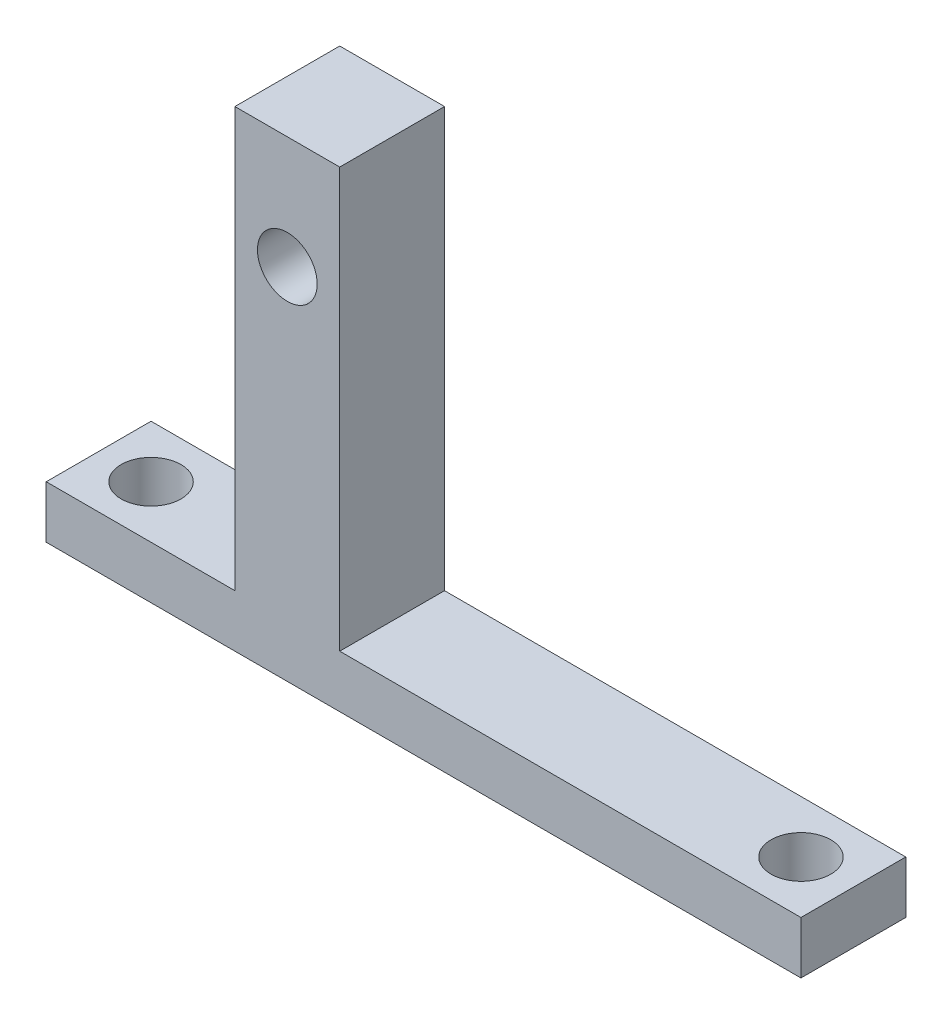
ISO-10303-21;
HEADER;
FILE_DESCRIPTION(('STEP AP214'),'2;1');
FILE_NAME('part.step','',(''),(''),'','','');
FILE_SCHEMA(('AUTOMOTIVE_DESIGN { 1 0 10303 214 1 1 1 1 }'));
ENDSEC;
DATA;
#1=APPLICATION_CONTEXT('core data for automotive mechanical design processes');
#2=APPLICATION_PROTOCOL_DEFINITION('international standard','automotive_design',2000,#1);
#3=PRODUCT_CONTEXT('',#1,'mechanical');
#4=PRODUCT('Part','Part','',(#3));
#5=PRODUCT_RELATED_PRODUCT_CATEGORY('part','',(#4));
#6=PRODUCT_DEFINITION_FORMATION('','',#4);
#7=PRODUCT_DEFINITION_CONTEXT('part definition',#1,'design');
#8=PRODUCT_DEFINITION('design','',#6,#7);
#9=PRODUCT_DEFINITION_SHAPE('','',#8);
#10=(LENGTH_UNIT() NAMED_UNIT(*) SI_UNIT(.MILLI.,.METRE.));
#11=(NAMED_UNIT(*) PLANE_ANGLE_UNIT() SI_UNIT($,.RADIAN.));
#12=(NAMED_UNIT(*) SI_UNIT($,.STERADIAN.) SOLID_ANGLE_UNIT());
#13=UNCERTAINTY_MEASURE_WITH_UNIT(LENGTH_MEASURE(1.E-05),#10,'distance_accuracy_value','');
#14=(GEOMETRIC_REPRESENTATION_CONTEXT(3) GLOBAL_UNCERTAINTY_ASSIGNED_CONTEXT((#13)) GLOBAL_UNIT_ASSIGNED_CONTEXT((#10,
#11,#12)) REPRESENTATION_CONTEXT('',''));
#15=CARTESIAN_POINT('',(0.,0.,0.));
#16=DIRECTION('',(0.,0.,1.));
#17=DIRECTION('',(1.,0.,0.));
#18=AXIS2_PLACEMENT_3D('',#15,#16,#17);
#19=CARTESIAN_POINT('',(0.,3.81,0.));
#20=DIRECTION('',(0.,1.,0.));
#21=DIRECTION('',(0.,0.,1.));
#22=AXIS2_PLACEMENT_3D('',#19,#20,#21);
#23=PLANE('',#22);
#24=DIRECTION('',(0.,0.,1.));
#25=VECTOR('',#24,1.);
#26=CARTESIAN_POINT('',(-10.9096097560975,3.81,25.0499756097561));
#27=LINE('',#26,#25);
#28=CARTESIAN_POINT('',(-10.9096097560975,3.81,25.0499756097561));
#29=VERTEX_POINT('',#28);
#30=CARTESIAN_POINT('',(-10.9096097560975,3.81,32.6699756097561));
#31=VERTEX_POINT('',#30);
#32=EDGE_CURVE('E50',#29,#31,#27,.T.);
#33=ORIENTED_EDGE('',*,*,#32,.F.);
#34=DIRECTION('',(-1.,0.,0.));
#35=VECTOR('',#34,1.);
#36=CARTESIAN_POINT('',(-24.6256097560975,3.81,25.0499756097561));
#37=LINE('',#36,#35);
#38=CARTESIAN_POINT('',(-24.6256097560975,3.81,25.0499756097561));
#39=VERTEX_POINT('',#38);
#40=EDGE_CURVE('E148',#29,#39,#37,.T.);
#41=ORIENTED_EDGE('',*,*,#40,.T.);
#42=DIRECTION('',(0.,0.,1.));
#43=VECTOR('',#42,1.);
#44=CARTESIAN_POINT('',(-24.6256097560975,3.81,25.0499756097561));
#45=LINE('',#44,#43);
#46=CARTESIAN_POINT('',(-24.6256097560975,3.81,32.6699756097561));
#47=VERTEX_POINT('',#46);
#48=EDGE_CURVE('E139',#39,#47,#45,.T.);
#49=ORIENTED_EDGE('',*,*,#48,.T.);
#50=DIRECTION('',(1.,0.,0.));
#51=VECTOR('',#50,1.);
#52=CARTESIAN_POINT('',(-24.6256097560975,3.81,32.6699756097561));
#53=LINE('',#52,#51);
#54=EDGE_CURVE('E144',#47,#31,#53,.T.);
#55=ORIENTED_EDGE('',*,*,#54,.T.);
#56=EDGE_LOOP('',(#33,#41,#49,#55));
#57=FACE_BOUND('',#56,.T.);
#58=CARTESIAN_POINT('',(-20.8156097560975,3.81,28.8599756097561));
#59=DIRECTION('',(0.,1.,0.));
#60=DIRECTION('',(0.,0.,1.));
#61=AXIS2_PLACEMENT_3D('',#58,#59,#60);
#62=CIRCLE('',#61,2.1717);
#63=CARTESIAN_POINT('',(-20.8156097560975,3.81,31.0316756097561));
#64=VERTEX_POINT('',#63);
#65=EDGE_CURVE('E134',#64,#64,#62,.T.);
#66=ORIENTED_EDGE('',*,*,#65,.F.);
#67=EDGE_LOOP('',(#66));
#68=FACE_BOUND('',#67,.T.);
#69=ADVANCED_FACE('F35',(#57,#68),#23,.T.);
#70=CARTESIAN_POINT('',(-24.6256097560975,3.81,25.0499756097561));
#71=DIRECTION('',(1.,0.,0.));
#72=DIRECTION('',(0.,0.,-1.));
#73=AXIS2_PLACEMENT_3D('',#70,#71,#72);
#74=PLANE('',#73);
#75=DIRECTION('',(0.,0.,1.));
#76=VECTOR('',#75,1.);
#77=CARTESIAN_POINT('',(-24.6256097560975,0.,25.0499756097561));
#78=LINE('',#77,#76);
#79=CARTESIAN_POINT('',(-24.6256097560975,0.,25.0499756097561));
#80=VERTEX_POINT('',#79);
#81=CARTESIAN_POINT('',(-24.6256097560975,0.,32.6699756097561));
#82=VERTEX_POINT('',#81);
#83=EDGE_CURVE('E133',#80,#82,#78,.T.);
#84=ORIENTED_EDGE('',*,*,#83,.T.);
#85=DIRECTION('',(0.,-1.,0.));
#86=VECTOR('',#85,1.);
#87=CARTESIAN_POINT('',(-24.6256097560975,3.81,32.6699756097561));
#88=LINE('',#87,#86);
#89=EDGE_CURVE('E11',#47,#82,#88,.T.);
#90=ORIENTED_EDGE('',*,*,#89,.F.);
#91=ORIENTED_EDGE('',*,*,#48,.F.);
#92=DIRECTION('',(0.,-1.,0.));
#93=VECTOR('',#92,1.);
#94=CARTESIAN_POINT('',(-24.6256097560975,3.81,25.0499756097561));
#95=LINE('',#94,#93);
#96=EDGE_CURVE('E151',#39,#80,#95,.T.);
#97=ORIENTED_EDGE('',*,*,#96,.T.);
#98=EDGE_LOOP('',(#84,#90,#91,#97));
#99=FACE_BOUND('',#98,.T.);
#100=ADVANCED_FACE('F37',(#99),#74,.F.);
#101=CARTESIAN_POINT('',(-24.6256097560975,3.81,32.6699756097561));
#102=DIRECTION('',(0.,0.,-1.));
#103=DIRECTION('',(-1.,0.,0.));
#104=AXIS2_PLACEMENT_3D('',#101,#102,#103);
#105=PLANE('',#104);
#106=CARTESIAN_POINT('',(-7.09960975609753,26.0985,32.6699756097561));
#107=DIRECTION('',(0.,0.,1.));
#108=DIRECTION('',(1.,0.,0.));
#109=AXIS2_PLACEMENT_3D('',#106,#107,#108);
#110=CIRCLE('',#109,2.1717);
#111=CARTESIAN_POINT('',(-4.92790975609753,26.0985,32.6699756097561));
#112=VERTEX_POINT('',#111);
#113=EDGE_CURVE('E191',#112,#112,#110,.T.);
#114=ORIENTED_EDGE('',*,*,#113,.F.);
#115=EDGE_LOOP('',(#114));
#116=FACE_BOUND('',#115,.T.);
#117=DIRECTION('',(1.,0.,0.));
#118=VECTOR('',#117,1.);
#119=CARTESIAN_POINT('',(-24.6256097560975,0.,32.6699756097561));
#120=LINE('',#119,#118);
#121=CARTESIAN_POINT('',(30.2383902439025,0.,32.6699756097561));
#122=VERTEX_POINT('',#121);
#123=EDGE_CURVE('E154',#82,#122,#120,.T.);
#124=ORIENTED_EDGE('',*,*,#123,.T.);
#125=DIRECTION('',(0.,-1.,0.));
#126=VECTOR('',#125,1.);
#127=CARTESIAN_POINT('',(30.2383902439025,3.81,32.6699756097561));
#128=LINE('',#127,#126);
#129=CARTESIAN_POINT('',(30.2383902439025,3.81,32.6699756097561));
#130=VERTEX_POINT('',#129);
#131=EDGE_CURVE('E43',#130,#122,#128,.T.);
#132=ORIENTED_EDGE('',*,*,#131,.F.);
#133=CARTESIAN_POINT('',(-3.28960975609753,3.81,32.6699756097561));
#134=VERTEX_POINT('',#133);
#135=EDGE_CURVE('E142',#134,#130,#53,.T.);
#136=ORIENTED_EDGE('',*,*,#135,.F.);
#137=DIRECTION('',(0.,-1.,0.));
#138=VECTOR('',#137,1.);
#139=CARTESIAN_POINT('',(-3.28960975609753,34.29,32.6699756097561));
#140=LINE('',#139,#138);
#141=CARTESIAN_POINT('',(-3.28960975609753,34.29,32.6699756097561));
#142=VERTEX_POINT('',#141);
#143=EDGE_CURVE('E106',#142,#134,#140,.T.);
#144=ORIENTED_EDGE('',*,*,#143,.F.);
#145=DIRECTION('',(1.,0.,0.));
#146=VECTOR('',#145,1.);
#147=CARTESIAN_POINT('',(-10.9096097560975,34.29,32.6699756097561));
#148=LINE('',#147,#146);
#149=CARTESIAN_POINT('',(-10.9096097560975,34.29,32.6699756097561));
#150=VERTEX_POINT('',#149);
#151=EDGE_CURVE('E100',#150,#142,#148,.T.);
#152=ORIENTED_EDGE('',*,*,#151,.F.);
#153=DIRECTION('',(0.,-1.,0.));
#154=VECTOR('',#153,1.);
#155=CARTESIAN_POINT('',(-10.9096097560975,34.29,32.6699756097561));
#156=LINE('',#155,#154);
#157=EDGE_CURVE('E104',#150,#31,#156,.T.);
#158=ORIENTED_EDGE('',*,*,#157,.T.);
#159=ORIENTED_EDGE('',*,*,#54,.F.);
#160=ORIENTED_EDGE('',*,*,#89,.T.);
#161=EDGE_LOOP('',(#124,#132,#136,#144,#152,#158,#159,#160));
#162=FACE_BOUND('',#161,.T.);
#163=ADVANCED_FACE('F102',(#116,#162),#105,.F.);
#164=CARTESIAN_POINT('',(30.2383902439025,3.81,25.0499756097561));
#165=DIRECTION('',(-1.,0.,0.));
#166=DIRECTION('',(0.,0.,1.));
#167=AXIS2_PLACEMENT_3D('',#164,#165,#166);
#168=PLANE('',#167);
#169=DIRECTION('',(0.,0.,-1.));
#170=VECTOR('',#169,1.);
#171=CARTESIAN_POINT('',(30.2383902439025,0.,25.0499756097561));
#172=LINE('',#171,#170);
#173=CARTESIAN_POINT('',(30.2383902439025,0.,25.0499756097561));
#174=VERTEX_POINT('',#173);
#175=EDGE_CURVE('E156',#122,#174,#172,.T.);
#176=ORIENTED_EDGE('',*,*,#175,.T.);
#177=DIRECTION('',(0.,-1.,0.));
#178=VECTOR('',#177,1.);
#179=CARTESIAN_POINT('',(30.2383902439025,3.81,25.0499756097561));
#180=LINE('',#179,#178);
#181=CARTESIAN_POINT('',(30.2383902439025,3.81,25.0499756097561));
#182=VERTEX_POINT('',#181);
#183=EDGE_CURVE('E161',#182,#174,#180,.T.);
#184=ORIENTED_EDGE('',*,*,#183,.F.);
#185=DIRECTION('',(0.,0.,-1.));
#186=VECTOR('',#185,1.);
#187=CARTESIAN_POINT('',(30.2383902439025,3.81,25.0499756097561));
#188=LINE('',#187,#186);
#189=EDGE_CURVE('E146',#130,#182,#188,.T.);
#190=ORIENTED_EDGE('',*,*,#189,.F.);
#191=ORIENTED_EDGE('',*,*,#131,.T.);
#192=EDGE_LOOP('',(#176,#184,#190,#191));
#193=FACE_BOUND('',#192,.T.);
#194=ADVANCED_FACE('F168',(#193),#168,.F.);
#195=CARTESIAN_POINT('',(-24.6256097560975,3.81,25.0499756097561));
#196=DIRECTION('',(0.,0.,1.));
#197=DIRECTION('',(1.,0.,0.));
#198=AXIS2_PLACEMENT_3D('',#195,#196,#197);
#199=PLANE('',#198);
#200=CARTESIAN_POINT('',(-7.09960975609753,26.0985,25.0499756097561));
#201=DIRECTION('',(0.,0.,1.));
#202=DIRECTION('',(1.,0.,0.));
#203=AXIS2_PLACEMENT_3D('',#200,#201,#202);
#204=CIRCLE('',#203,2.1717);
#205=CARTESIAN_POINT('',(-4.92790975609753,26.0985,25.0499756097561));
#206=VERTEX_POINT('',#205);
#207=EDGE_CURVE('E188',#206,#206,#204,.T.);
#208=ORIENTED_EDGE('',*,*,#207,.T.);
#209=EDGE_LOOP('',(#208));
#210=FACE_BOUND('',#209,.T.);
#211=DIRECTION('',(-1.,0.,0.));
#212=VECTOR('',#211,1.);
#213=CARTESIAN_POINT('',(-24.6256097560975,0.,25.0499756097561));
#214=LINE('',#213,#212);
#215=EDGE_CURVE('E143',#174,#80,#214,.T.);
#216=ORIENTED_EDGE('',*,*,#215,.T.);
#217=ORIENTED_EDGE('',*,*,#96,.F.);
#218=ORIENTED_EDGE('',*,*,#40,.F.);
#219=DIRECTION('',(0.,-1.,0.));
#220=VECTOR('',#219,1.);
#221=CARTESIAN_POINT('',(-10.9096097560975,34.29,25.0499756097561));
#222=LINE('',#221,#220);
#223=CARTESIAN_POINT('',(-10.9096097560975,34.29,25.0499756097561));
#224=VERTEX_POINT('',#223);
#225=EDGE_CURVE('E182',#224,#29,#222,.T.);
#226=ORIENTED_EDGE('',*,*,#225,.F.);
#227=DIRECTION('',(-1.,0.,0.));
#228=VECTOR('',#227,1.);
#229=CARTESIAN_POINT('',(-10.9096097560975,34.29,25.0499756097561));
#230=LINE('',#229,#228);
#231=CARTESIAN_POINT('',(-3.28960975609753,34.29,25.0499756097561));
#232=VERTEX_POINT('',#231);
#233=EDGE_CURVE('E115',#232,#224,#230,.T.);
#234=ORIENTED_EDGE('',*,*,#233,.F.);
#235=DIRECTION('',(0.,-1.,0.));
#236=VECTOR('',#235,1.);
#237=CARTESIAN_POINT('',(-3.28960975609753,34.29,25.0499756097561));
#238=LINE('',#237,#236);
#239=CARTESIAN_POINT('',(-3.28960975609753,3.81,25.0499756097561));
#240=VERTEX_POINT('',#239);
#241=EDGE_CURVE('E126',#232,#240,#238,.T.);
#242=ORIENTED_EDGE('',*,*,#241,.T.);
#243=EDGE_CURVE('E149',#182,#240,#37,.T.);
#244=ORIENTED_EDGE('',*,*,#243,.F.);
#245=ORIENTED_EDGE('',*,*,#183,.T.);
#246=EDGE_LOOP('',(#216,#217,#218,#226,#234,#242,#244,#245));
#247=FACE_BOUND('',#246,.T.);
#248=ADVANCED_FACE('F176',(#210,#247),#199,.F.);
#249=DIRECTION('',(0.,0.,-1.));
#250=VECTOR('',#249,1.);
#251=CARTESIAN_POINT('',(-3.28960975609753,3.81,25.0499756097561));
#252=LINE('',#251,#250);
#253=EDGE_CURVE('E58',#134,#240,#252,.T.);
#254=ORIENTED_EDGE('',*,*,#253,.F.);
#255=ORIENTED_EDGE('',*,*,#135,.T.);
#256=ORIENTED_EDGE('',*,*,#189,.T.);
#257=ORIENTED_EDGE('',*,*,#243,.T.);
#258=EDGE_LOOP('',(#254,#255,#256,#257));
#259=FACE_BOUND('',#258,.T.);
#260=CARTESIAN_POINT('',(26.4283902439025,3.81,28.8599756097561));
#261=DIRECTION('',(0.,1.,0.));
#262=DIRECTION('',(0.,0.,1.));
#263=AXIS2_PLACEMENT_3D('',#260,#261,#262);
#264=CIRCLE('',#263,2.1717);
#265=CARTESIAN_POINT('',(26.4283902439025,3.81,31.0316756097561));
#266=VERTEX_POINT('',#265);
#267=EDGE_CURVE('E121',#266,#266,#264,.T.);
#268=ORIENTED_EDGE('',*,*,#267,.F.);
#269=EDGE_LOOP('',(#268));
#270=FACE_BOUND('',#269,.T.);
#271=ADVANCED_FACE('F212',(#259,#270),#23,.T.);
#272=CARTESIAN_POINT('',(0.,0.,0.));
#273=DIRECTION('',(0.,1.,0.));
#274=DIRECTION('',(0.,0.,1.));
#275=AXIS2_PLACEMENT_3D('',#272,#273,#274);
#276=PLANE('',#275);
#277=CARTESIAN_POINT('',(-20.8156097560975,0.,28.8599756097561));
#278=DIRECTION('',(0.,1.,0.));
#279=DIRECTION('',(0.,0.,1.));
#280=AXIS2_PLACEMENT_3D('',#277,#278,#279);
#281=CIRCLE('',#280,2.1717);
#282=CARTESIAN_POINT('',(-20.8156097560975,0.,31.0316756097561));
#283=VERTEX_POINT('',#282);
#284=EDGE_CURVE('E130',#283,#283,#281,.T.);
#285=ORIENTED_EDGE('',*,*,#284,.T.);
#286=EDGE_LOOP('',(#285));
#287=FACE_BOUND('',#286,.T.);
#288=CARTESIAN_POINT('',(26.4283902439025,0.,28.8599756097561));
#289=DIRECTION('',(0.,1.,0.));
#290=DIRECTION('',(0.,0.,1.));
#291=AXIS2_PLACEMENT_3D('',#288,#289,#290);
#292=CIRCLE('',#291,2.1717);
#293=CARTESIAN_POINT('',(26.4283902439025,0.,31.0316756097561));
#294=VERTEX_POINT('',#293);
#295=EDGE_CURVE('E124',#294,#294,#292,.T.);
#296=ORIENTED_EDGE('',*,*,#295,.T.);
#297=EDGE_LOOP('',(#296));
#298=FACE_BOUND('',#297,.T.);
#299=ORIENTED_EDGE('',*,*,#83,.F.);
#300=ORIENTED_EDGE('',*,*,#215,.F.);
#301=ORIENTED_EDGE('',*,*,#175,.F.);
#302=ORIENTED_EDGE('',*,*,#123,.F.);
#303=EDGE_LOOP('',(#299,#300,#301,#302));
#304=FACE_BOUND('',#303,.T.);
#305=ADVANCED_FACE('F173',(#287,#298,#304),#276,.F.);
#306=CARTESIAN_POINT('',(26.4283902439025,0.,28.8599756097561));
#307=DIRECTION('',(0.,1.,0.));
#308=DIRECTION('',(0.,0.,1.));
#309=AXIS2_PLACEMENT_3D('',#306,#307,#308);
#310=CYLINDRICAL_SURFACE('',#309,2.1717);
#311=CARTESIAN_POINT('',(26.4283902439025,0.,31.0316756097561));
#312=CARTESIAN_POINT('',(26.4283902439025,0.0396874999999999,31.0316756097561));
#313=CARTESIAN_POINT('',(26.4283902439025,0.079375,31.0316756097561));
#314=CARTESIAN_POINT('',(26.4283902439025,0.15875,31.0316756097561));
#315=CARTESIAN_POINT('',(26.4283902439025,0.1984375,31.0316756097561));
#316=CARTESIAN_POINT('',(26.4283902439025,0.2778125,31.0316756097561));
#317=CARTESIAN_POINT('',(26.4283902439025,0.3175,31.0316756097561));
#318=CARTESIAN_POINT('',(26.4283902439025,0.396875,31.0316756097561));
#319=CARTESIAN_POINT('',(26.4283902439025,0.4365625,31.0316756097561));
#320=CARTESIAN_POINT('',(26.4283902439025,0.5159375,31.0316756097561));
#321=CARTESIAN_POINT('',(26.4283902439025,0.555625,31.0316756097561));
#322=CARTESIAN_POINT('',(26.4283902439025,0.635,31.0316756097561));
#323=CARTESIAN_POINT('',(26.4283902439025,0.6746875,31.0316756097561));
#324=CARTESIAN_POINT('',(26.4283902439025,0.7540625,31.0316756097561));
#325=CARTESIAN_POINT('',(26.4283902439025,0.79375,31.0316756097561));
#326=CARTESIAN_POINT('',(26.4283902439025,0.873125,31.0316756097561));
#327=CARTESIAN_POINT('',(26.4283902439025,0.9128125,31.0316756097561));
#328=CARTESIAN_POINT('',(26.4283902439025,0.9921875,31.0316756097561));
#329=CARTESIAN_POINT('',(26.4283902439025,1.031875,31.0316756097561));
#330=CARTESIAN_POINT('',(26.4283902439025,1.11125,31.0316756097561));
#331=CARTESIAN_POINT('',(26.4283902439025,1.1509375,31.0316756097561));
#332=CARTESIAN_POINT('',(26.4283902439025,1.2303125,31.0316756097561));
#333=CARTESIAN_POINT('',(26.4283902439025,1.27,31.0316756097561));
#334=CARTESIAN_POINT('',(26.4283902439025,1.349375,31.0316756097561));
#335=CARTESIAN_POINT('',(26.4283902439025,1.3890625,31.0316756097561));
#336=CARTESIAN_POINT('',(26.4283902439025,1.4684375,31.0316756097561));
#337=CARTESIAN_POINT('',(26.4283902439025,1.508125,31.0316756097561));
#338=CARTESIAN_POINT('',(26.4283902439025,1.5875,31.0316756097561));
#339=CARTESIAN_POINT('',(26.4283902439025,1.6271875,31.0316756097561));
#340=CARTESIAN_POINT('',(26.4283902439025,1.7065625,31.0316756097561));
#341=CARTESIAN_POINT('',(26.4283902439025,1.74625,31.0316756097561));
#342=CARTESIAN_POINT('',(26.4283902439025,1.825625,31.0316756097561));
#343=CARTESIAN_POINT('',(26.4283902439025,1.8653125,31.0316756097561));
#344=CARTESIAN_POINT('',(26.4283902439025,1.9446875,31.0316756097561));
#345=CARTESIAN_POINT('',(26.4283902439025,1.984375,31.0316756097561));
#346=CARTESIAN_POINT('',(26.4283902439025,2.06375,31.0316756097561));
#347=CARTESIAN_POINT('',(26.4283902439025,2.1034375,31.0316756097561));
#348=CARTESIAN_POINT('',(26.4283902439025,2.1828125,31.0316756097561));
#349=CARTESIAN_POINT('',(26.4283902439025,2.2225,31.0316756097561));
#350=CARTESIAN_POINT('',(26.4283902439025,2.301875,31.0316756097561));
#351=CARTESIAN_POINT('',(26.4283902439025,2.3415625,31.0316756097561));
#352=CARTESIAN_POINT('',(26.4283902439025,2.4209375,31.0316756097561));
#353=CARTESIAN_POINT('',(26.4283902439025,2.460625,31.0316756097561));
#354=CARTESIAN_POINT('',(26.4283902439025,2.54,31.0316756097561));
#355=CARTESIAN_POINT('',(26.4283902439025,2.5796875,31.0316756097561));
#356=CARTESIAN_POINT('',(26.4283902439025,2.6590625,31.0316756097561));
#357=CARTESIAN_POINT('',(26.4283902439025,2.69875,31.0316756097561));
#358=CARTESIAN_POINT('',(26.4283902439025,2.778125,31.0316756097561));
#359=CARTESIAN_POINT('',(26.4283902439025,2.8178125,31.0316756097561));
#360=CARTESIAN_POINT('',(26.4283902439025,2.8971875,31.0316756097561));
#361=CARTESIAN_POINT('',(26.4283902439025,2.936875,31.0316756097561));
#362=CARTESIAN_POINT('',(26.4283902439025,3.01625,31.0316756097561));
#363=CARTESIAN_POINT('',(26.4283902439025,3.0559375,31.0316756097561));
#364=CARTESIAN_POINT('',(26.4283902439025,3.1353125,31.0316756097561));
#365=CARTESIAN_POINT('',(26.4283902439025,3.175,31.0316756097561));
#366=CARTESIAN_POINT('',(26.4283902439025,3.254375,31.0316756097561));
#367=CARTESIAN_POINT('',(26.4283902439025,3.2940625,31.0316756097561));
#368=CARTESIAN_POINT('',(26.4283902439025,3.3734375,31.0316756097561));
#369=CARTESIAN_POINT('',(26.4283902439025,3.413125,31.0316756097561));
#370=CARTESIAN_POINT('',(26.4283902439025,3.4925,31.0316756097561));
#371=CARTESIAN_POINT('',(26.4283902439025,3.5321875,31.0316756097561));
#372=CARTESIAN_POINT('',(26.4283902439025,3.6115625,31.0316756097561));
#373=CARTESIAN_POINT('',(26.4283902439025,3.65125,31.0316756097561));
#374=CARTESIAN_POINT('',(26.4283902439025,3.730625,31.0316756097561));
#375=CARTESIAN_POINT('',(26.4283902439025,3.7703125,31.0316756097561));
#376=CARTESIAN_POINT('',(26.4283902439025,3.81,31.0316756097561));
#377=B_SPLINE_CURVE_WITH_KNOTS('',3,(#311,#312,#313,#314,#315,#316,#317,#318,#319,#320,#321,
#322,#323,#324,#325,#326,#327,#328,#329,#330,#331,#332,#333,#334,#335,#336,#337,#338,#339,#340,
#341,#342,#343,#344,#345,#346,#347,#348,#349,#350,#351,#352,#353,#354,#355,#356,#357,#358,#359,
#360,#361,#362,#363,#364,#365,#366,#367,#368,#369,#370,#371,#372,#373,#374,#375,#376),
.UNSPECIFIED.,.F.,.F.,(4,2,2,2,2,2,2,2,2,2,2,2,2,2,2,2,2,2,2,2,2,2,2,2,2,2,2,2,2,2,2,2,4),(0.,
0.1190625,0.238125,0.3571875,0.47625,0.5953125,0.714375,0.8334375,0.9525,1.0715625,1.190625,
1.3096875,1.42875,1.5478125,1.666875,1.7859375,1.905,2.0240625,2.143125,2.2621875,2.38125,
2.5003125,2.619375,2.7384375,2.8575,2.9765625,3.095625,3.2146875,3.33375,3.4528125,3.571875,
3.6909375,3.81),.UNSPECIFIED.);
#378=EDGE_CURVE('BSEAM222',#294,#266,#377,.T.);
#379=ORIENTED_EDGE('',*,*,#295,.F.);
#380=ORIENTED_EDGE('',*,*,#267,.T.);
#381=ORIENTED_EDGE('',*,*,#378,.T.);
#382=ORIENTED_EDGE('',*,*,#378,.F.);
#383=EDGE_LOOP('',(#379,#381,#380,#382));
#384=FACE_BOUND('',#383,.T.);
#385=ADVANCED_FACE('F222',(#384),#310,.F.);
#386=CARTESIAN_POINT('',(-20.8156097560975,0.,28.8599756097561));
#387=DIRECTION('',(0.,1.,0.));
#388=DIRECTION('',(0.,0.,1.));
#389=AXIS2_PLACEMENT_3D('',#386,#387,#388);
#390=CYLINDRICAL_SURFACE('',#389,2.1717);
#391=CARTESIAN_POINT('',(-20.8156097560975,0.,31.0316756097561));
#392=CARTESIAN_POINT('',(-20.8156097560975,0.0396874999999999,31.0316756097561));
#393=CARTESIAN_POINT('',(-20.8156097560975,0.079375,31.0316756097561));
#394=CARTESIAN_POINT('',(-20.8156097560975,0.15875,31.0316756097561));
#395=CARTESIAN_POINT('',(-20.8156097560975,0.1984375,31.0316756097561));
#396=CARTESIAN_POINT('',(-20.8156097560975,0.2778125,31.0316756097561));
#397=CARTESIAN_POINT('',(-20.8156097560975,0.3175,31.0316756097561));
#398=CARTESIAN_POINT('',(-20.8156097560975,0.396875,31.0316756097561));
#399=CARTESIAN_POINT('',(-20.8156097560975,0.4365625,31.0316756097561));
#400=CARTESIAN_POINT('',(-20.8156097560975,0.5159375,31.0316756097561));
#401=CARTESIAN_POINT('',(-20.8156097560975,0.555625,31.0316756097561));
#402=CARTESIAN_POINT('',(-20.8156097560975,0.635,31.0316756097561));
#403=CARTESIAN_POINT('',(-20.8156097560975,0.6746875,31.0316756097561));
#404=CARTESIAN_POINT('',(-20.8156097560975,0.7540625,31.0316756097561));
#405=CARTESIAN_POINT('',(-20.8156097560975,0.79375,31.0316756097561));
#406=CARTESIAN_POINT('',(-20.8156097560975,0.873125,31.0316756097561));
#407=CARTESIAN_POINT('',(-20.8156097560975,0.9128125,31.0316756097561));
#408=CARTESIAN_POINT('',(-20.8156097560975,0.9921875,31.0316756097561));
#409=CARTESIAN_POINT('',(-20.8156097560975,1.031875,31.0316756097561));
#410=CARTESIAN_POINT('',(-20.8156097560975,1.11125,31.0316756097561));
#411=CARTESIAN_POINT('',(-20.8156097560975,1.1509375,31.0316756097561));
#412=CARTESIAN_POINT('',(-20.8156097560975,1.2303125,31.0316756097561));
#413=CARTESIAN_POINT('',(-20.8156097560975,1.27,31.0316756097561));
#414=CARTESIAN_POINT('',(-20.8156097560975,1.349375,31.0316756097561));
#415=CARTESIAN_POINT('',(-20.8156097560975,1.3890625,31.0316756097561));
#416=CARTESIAN_POINT('',(-20.8156097560975,1.4684375,31.0316756097561));
#417=CARTESIAN_POINT('',(-20.8156097560975,1.508125,31.0316756097561));
#418=CARTESIAN_POINT('',(-20.8156097560975,1.5875,31.0316756097561));
#419=CARTESIAN_POINT('',(-20.8156097560975,1.6271875,31.0316756097561));
#420=CARTESIAN_POINT('',(-20.8156097560975,1.7065625,31.0316756097561));
#421=CARTESIAN_POINT('',(-20.8156097560975,1.74625,31.0316756097561));
#422=CARTESIAN_POINT('',(-20.8156097560975,1.825625,31.0316756097561));
#423=CARTESIAN_POINT('',(-20.8156097560975,1.8653125,31.0316756097561));
#424=CARTESIAN_POINT('',(-20.8156097560975,1.9446875,31.0316756097561));
#425=CARTESIAN_POINT('',(-20.8156097560975,1.984375,31.0316756097561));
#426=CARTESIAN_POINT('',(-20.8156097560975,2.06375,31.0316756097561));
#427=CARTESIAN_POINT('',(-20.8156097560975,2.1034375,31.0316756097561));
#428=CARTESIAN_POINT('',(-20.8156097560975,2.1828125,31.0316756097561));
#429=CARTESIAN_POINT('',(-20.8156097560975,2.2225,31.0316756097561));
#430=CARTESIAN_POINT('',(-20.8156097560975,2.301875,31.0316756097561));
#431=CARTESIAN_POINT('',(-20.8156097560975,2.3415625,31.0316756097561));
#432=CARTESIAN_POINT('',(-20.8156097560975,2.4209375,31.0316756097561));
#433=CARTESIAN_POINT('',(-20.8156097560975,2.460625,31.0316756097561));
#434=CARTESIAN_POINT('',(-20.8156097560975,2.54,31.0316756097561));
#435=CARTESIAN_POINT('',(-20.8156097560975,2.5796875,31.0316756097561));
#436=CARTESIAN_POINT('',(-20.8156097560975,2.6590625,31.0316756097561));
#437=CARTESIAN_POINT('',(-20.8156097560975,2.69875,31.0316756097561));
#438=CARTESIAN_POINT('',(-20.8156097560975,2.778125,31.0316756097561));
#439=CARTESIAN_POINT('',(-20.8156097560975,2.8178125,31.0316756097561));
#440=CARTESIAN_POINT('',(-20.8156097560975,2.8971875,31.0316756097561));
#441=CARTESIAN_POINT('',(-20.8156097560975,2.936875,31.0316756097561));
#442=CARTESIAN_POINT('',(-20.8156097560975,3.01625,31.0316756097561));
#443=CARTESIAN_POINT('',(-20.8156097560975,3.0559375,31.0316756097561));
#444=CARTESIAN_POINT('',(-20.8156097560975,3.1353125,31.0316756097561));
#445=CARTESIAN_POINT('',(-20.8156097560975,3.175,31.0316756097561));
#446=CARTESIAN_POINT('',(-20.8156097560975,3.254375,31.0316756097561));
#447=CARTESIAN_POINT('',(-20.8156097560975,3.2940625,31.0316756097561));
#448=CARTESIAN_POINT('',(-20.8156097560975,3.3734375,31.0316756097561));
#449=CARTESIAN_POINT('',(-20.8156097560975,3.413125,31.0316756097561));
#450=CARTESIAN_POINT('',(-20.8156097560975,3.4925,31.0316756097561));
#451=CARTESIAN_POINT('',(-20.8156097560975,3.5321875,31.0316756097561));
#452=CARTESIAN_POINT('',(-20.8156097560975,3.6115625,31.0316756097561));
#453=CARTESIAN_POINT('',(-20.8156097560975,3.65125,31.0316756097561));
#454=CARTESIAN_POINT('',(-20.8156097560975,3.730625,31.0316756097561));
#455=CARTESIAN_POINT('',(-20.8156097560975,3.7703125,31.0316756097561));
#456=CARTESIAN_POINT('',(-20.8156097560975,3.81,31.0316756097561));
#457=B_SPLINE_CURVE_WITH_KNOTS('',3,(#391,#392,#393,#394,#395,#396,#397,#398,#399,#400,#401,
#402,#403,#404,#405,#406,#407,#408,#409,#410,#411,#412,#413,#414,#415,#416,#417,#418,#419,#420,
#421,#422,#423,#424,#425,#426,#427,#428,#429,#430,#431,#432,#433,#434,#435,#436,#437,#438,#439,
#440,#441,#442,#443,#444,#445,#446,#447,#448,#449,#450,#451,#452,#453,#454,#455,#456),
.UNSPECIFIED.,.F.,.F.,(4,2,2,2,2,2,2,2,2,2,2,2,2,2,2,2,2,2,2,2,2,2,2,2,2,2,2,2,2,2,2,2,4),(0.,
0.1190625,0.238125,0.3571875,0.47625,0.5953125,0.714375,0.8334375,0.9525,1.0715625,1.190625,
1.3096875,1.42875,1.5478125,1.666875,1.7859375,1.905,2.0240625,2.143125,2.2621875,2.38125,
2.5003125,2.619375,2.7384375,2.8575,2.9765625,3.095625,3.2146875,3.33375,3.4528125,3.571875,
3.6909375,3.81),.UNSPECIFIED.);
#458=EDGE_CURVE('BSEAM229',#283,#64,#457,.T.);
#459=ORIENTED_EDGE('',*,*,#284,.F.);
#460=ORIENTED_EDGE('',*,*,#65,.T.);
#461=ORIENTED_EDGE('',*,*,#458,.T.);
#462=ORIENTED_EDGE('',*,*,#458,.F.);
#463=EDGE_LOOP('',(#459,#461,#460,#462));
#464=FACE_BOUND('',#463,.T.);
#465=ADVANCED_FACE('F229',(#464),#390,.F.);
#466=CARTESIAN_POINT('',(-10.9096097560975,34.29,25.0499756097561));
#467=DIRECTION('',(1.,0.,0.));
#468=DIRECTION('',(0.,0.,-1.));
#469=AXIS2_PLACEMENT_3D('',#466,#467,#468);
#470=PLANE('',#469);
#471=ORIENTED_EDGE('',*,*,#32,.T.);
#472=ORIENTED_EDGE('',*,*,#157,.F.);
#473=DIRECTION('',(0.,0.,1.));
#474=VECTOR('',#473,1.);
#475=CARTESIAN_POINT('',(-10.9096097560975,34.29,25.0499756097561));
#476=LINE('',#475,#474);
#477=EDGE_CURVE('E110',#224,#150,#476,.T.);
#478=ORIENTED_EDGE('',*,*,#477,.F.);
#479=ORIENTED_EDGE('',*,*,#225,.T.);
#480=EDGE_LOOP('',(#471,#472,#478,#479));
#481=FACE_BOUND('',#480,.T.);
#482=ADVANCED_FACE('F120',(#481),#470,.F.);
#483=CARTESIAN_POINT('',(-3.28960975609753,34.29,25.0499756097561));
#484=DIRECTION('',(-1.,0.,0.));
#485=DIRECTION('',(0.,0.,1.));
#486=AXIS2_PLACEMENT_3D('',#483,#484,#485);
#487=PLANE('',#486);
#488=ORIENTED_EDGE('',*,*,#253,.T.);
#489=ORIENTED_EDGE('',*,*,#241,.F.);
#490=DIRECTION('',(0.,0.,-1.));
#491=VECTOR('',#490,1.);
#492=CARTESIAN_POINT('',(-3.28960975609753,34.29,25.0499756097561));
#493=LINE('',#492,#491);
#494=EDGE_CURVE('E109',#142,#232,#493,.T.);
#495=ORIENTED_EDGE('',*,*,#494,.F.);
#496=ORIENTED_EDGE('',*,*,#143,.T.);
#497=EDGE_LOOP('',(#488,#489,#495,#496));
#498=FACE_BOUND('',#497,.T.);
#499=ADVANCED_FACE('F240',(#498),#487,.F.);
#500=CARTESIAN_POINT('',(0.,34.29,0.));
#501=DIRECTION('',(0.,1.,0.));
#502=DIRECTION('',(0.,0.,1.));
#503=AXIS2_PLACEMENT_3D('',#500,#501,#502);
#504=PLANE('',#503);
#505=ORIENTED_EDGE('',*,*,#477,.T.);
#506=ORIENTED_EDGE('',*,*,#151,.T.);
#507=ORIENTED_EDGE('',*,*,#494,.T.);
#508=ORIENTED_EDGE('',*,*,#233,.T.);
#509=EDGE_LOOP('',(#505,#506,#507,#508));
#510=FACE_BOUND('',#509,.T.);
#511=ADVANCED_FACE('F113',(#510),#504,.T.);
#512=CARTESIAN_POINT('',(-7.09960975609753,26.0985,25.0499756097561));
#513=DIRECTION('',(0.,0.,1.));
#514=DIRECTION('',(1.,0.,0.));
#515=AXIS2_PLACEMENT_3D('',#512,#513,#514);
#516=CYLINDRICAL_SURFACE('',#515,2.1717);
#517=CARTESIAN_POINT('',(-4.92790975609753,26.0985,25.0499756097561));
#518=CARTESIAN_POINT('',(-4.92790975609753,26.0985,25.1293506097561));
#519=CARTESIAN_POINT('',(-4.92790975609753,26.0985,25.2087256097561));
#520=CARTESIAN_POINT('',(-4.92790975609753,26.0985,25.3674756097561));
#521=CARTESIAN_POINT('',(-4.92790975609753,26.0985,25.4468506097561));
#522=CARTESIAN_POINT('',(-4.92790975609753,26.0985,25.6056006097561));
#523=CARTESIAN_POINT('',(-4.92790975609753,26.0985,25.6849756097561));
#524=CARTESIAN_POINT('',(-4.92790975609753,26.0985,25.8437256097561));
#525=CARTESIAN_POINT('',(-4.92790975609753,26.0985,25.9231006097561));
#526=CARTESIAN_POINT('',(-4.92790975609753,26.0985,26.0818506097561));
#527=CARTESIAN_POINT('',(-4.92790975609753,26.0985,26.1612256097561));
#528=CARTESIAN_POINT('',(-4.92790975609753,26.0985,26.3199756097561));
#529=CARTESIAN_POINT('',(-4.92790975609753,26.0985,26.3993506097561));
#530=CARTESIAN_POINT('',(-4.92790975609753,26.0985,26.5581006097561));
#531=CARTESIAN_POINT('',(-4.92790975609753,26.0985,26.6374756097561));
#532=CARTESIAN_POINT('',(-4.92790975609753,26.0985,26.7962256097561));
#533=CARTESIAN_POINT('',(-4.92790975609753,26.0985,26.8756006097561));
#534=CARTESIAN_POINT('',(-4.92790975609753,26.0985,27.0343506097561));
#535=CARTESIAN_POINT('',(-4.92790975609753,26.0985,27.1137256097561));
#536=CARTESIAN_POINT('',(-4.92790975609753,26.0985,27.2724756097561));
#537=CARTESIAN_POINT('',(-4.92790975609753,26.0985,27.3518506097561));
#538=CARTESIAN_POINT('',(-4.92790975609753,26.0985,27.5106006097561));
#539=CARTESIAN_POINT('',(-4.92790975609753,26.0985,27.5899756097561));
#540=CARTESIAN_POINT('',(-4.92790975609753,26.0985,27.7487256097561));
#541=CARTESIAN_POINT('',(-4.92790975609753,26.0985,27.8281006097561));
#542=CARTESIAN_POINT('',(-4.92790975609753,26.0985,27.9868506097561));
#543=CARTESIAN_POINT('',(-4.92790975609753,26.0985,28.0662256097561));
#544=CARTESIAN_POINT('',(-4.92790975609753,26.0985,28.2249756097561));
#545=CARTESIAN_POINT('',(-4.92790975609753,26.0985,28.3043506097561));
#546=CARTESIAN_POINT('',(-4.92790975609753,26.0985,28.4631006097561));
#547=CARTESIAN_POINT('',(-4.92790975609753,26.0985,28.5424756097561));
#548=CARTESIAN_POINT('',(-4.92790975609753,26.0985,28.7012256097561));
#549=CARTESIAN_POINT('',(-4.92790975609753,26.0985,28.7806006097561));
#550=CARTESIAN_POINT('',(-4.92790975609753,26.0985,28.9393506097561));
#551=CARTESIAN_POINT('',(-4.92790975609753,26.0985,29.0187256097561));
#552=CARTESIAN_POINT('',(-4.92790975609753,26.0985,29.1774756097561));
#553=CARTESIAN_POINT('',(-4.92790975609753,26.0985,29.2568506097561));
#554=CARTESIAN_POINT('',(-4.92790975609753,26.0985,29.4156006097561));
#555=CARTESIAN_POINT('',(-4.92790975609753,26.0985,29.4949756097561));
#556=CARTESIAN_POINT('',(-4.92790975609753,26.0985,29.6537256097561));
#557=CARTESIAN_POINT('',(-4.92790975609753,26.0985,29.7331006097561));
#558=CARTESIAN_POINT('',(-4.92790975609753,26.0985,29.8918506097561));
#559=CARTESIAN_POINT('',(-4.92790975609753,26.0985,29.9712256097561));
#560=CARTESIAN_POINT('',(-4.92790975609753,26.0985,30.1299756097561));
#561=CARTESIAN_POINT('',(-4.92790975609753,26.0985,30.2093506097561));
#562=CARTESIAN_POINT('',(-4.92790975609753,26.0985,30.3681006097561));
#563=CARTESIAN_POINT('',(-4.92790975609753,26.0985,30.4474756097561));
#564=CARTESIAN_POINT('',(-4.92790975609753,26.0985,30.6062256097561));
#565=CARTESIAN_POINT('',(-4.92790975609753,26.0985,30.6856006097561));
#566=CARTESIAN_POINT('',(-4.92790975609753,26.0985,30.8443506097561));
#567=CARTESIAN_POINT('',(-4.92790975609753,26.0985,30.9237256097561));
#568=CARTESIAN_POINT('',(-4.92790975609753,26.0985,31.0824756097561));
#569=CARTESIAN_POINT('',(-4.92790975609753,26.0985,31.1618506097561));
#570=CARTESIAN_POINT('',(-4.92790975609753,26.0985,31.3206006097561));
#571=CARTESIAN_POINT('',(-4.92790975609753,26.0985,31.3999756097561));
#572=CARTESIAN_POINT('',(-4.92790975609753,26.0985,31.5587256097561));
#573=CARTESIAN_POINT('',(-4.92790975609753,26.0985,31.6381006097561));
#574=CARTESIAN_POINT('',(-4.92790975609753,26.0985,31.7968506097561));
#575=CARTESIAN_POINT('',(-4.92790975609753,26.0985,31.8762256097561));
#576=CARTESIAN_POINT('',(-4.92790975609753,26.0985,32.0349756097561));
#577=CARTESIAN_POINT('',(-4.92790975609753,26.0985,32.1143506097561));
#578=CARTESIAN_POINT('',(-4.92790975609753,26.0985,32.2731006097561));
#579=CARTESIAN_POINT('',(-4.92790975609753,26.0985,32.3524756097561));
#580=CARTESIAN_POINT('',(-4.92790975609753,26.0985,32.5112256097561));
#581=CARTESIAN_POINT('',(-4.92790975609753,26.0985,32.5906006097561));
#582=CARTESIAN_POINT('',(-4.92790975609753,26.0985,32.6699756097561));
#583=B_SPLINE_CURVE_WITH_KNOTS('',3,(#517,#518,#519,#520,#521,#522,#523,#524,#525,#526,#527,
#528,#529,#530,#531,#532,#533,#534,#535,#536,#537,#538,#539,#540,#541,#542,#543,#544,#545,#546,
#547,#548,#549,#550,#551,#552,#553,#554,#555,#556,#557,#558,#559,#560,#561,#562,#563,#564,#565,
#566,#567,#568,#569,#570,#571,#572,#573,#574,#575,#576,#577,#578,#579,#580,#581,#582),
.UNSPECIFIED.,.F.,.F.,(4,2,2,2,2,2,2,2,2,2,2,2,2,2,2,2,2,2,2,2,2,2,2,2,2,2,2,2,2,2,2,2,4),(0.,
0.238125000000002,0.476250000000001,0.714375,0.952500000000002,1.190625,1.42875,1.666875,1.905,
2.143125,2.38125,2.619375,2.8575,3.095625,3.33375,3.571875,3.81,4.048125,4.28625,4.524375,
4.7625,5.000625,5.23875,5.476875,5.715,5.953125,6.19125,6.429375,6.6675,6.905625,7.14375,
7.381875,7.61999999999999),.UNSPECIFIED.);
#584=EDGE_CURVE('BSEAM198',#206,#112,#583,.T.);
#585=ORIENTED_EDGE('',*,*,#207,.F.);
#586=ORIENTED_EDGE('',*,*,#113,.T.);
#587=ORIENTED_EDGE('',*,*,#584,.T.);
#588=ORIENTED_EDGE('',*,*,#584,.F.);
#589=EDGE_LOOP('',(#585,#587,#586,#588));
#590=FACE_BOUND('',#589,.T.);
#591=ADVANCED_FACE('F198',(#590),#516,.F.);
#592=CLOSED_SHELL('',(#69,#100,#163,#194,#248,#271,#305,#385,#465,#482,#499,#511,#591));
#593=MANIFOLD_SOLID_BREP('B2',#592);
#594=ADVANCED_BREP_SHAPE_REPRESENTATION('',(#18,#593),#14);
#595=SHAPE_DEFINITION_REPRESENTATION(#9,#594);
ENDSEC;
END-ISO-10303-21;
